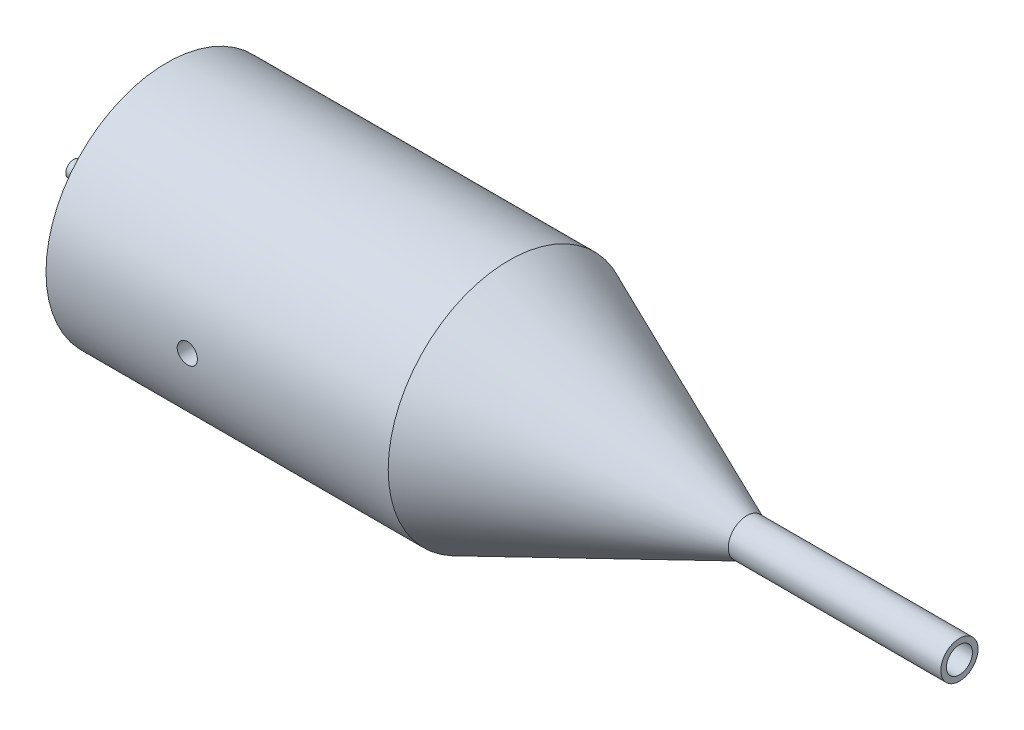
ISO-10303-21;
HEADER;
FILE_DESCRIPTION(('STEP AP214'),'2;1');
FILE_NAME('part.step','',(''),(''),'','','');
FILE_SCHEMA(('AUTOMOTIVE_DESIGN { 1 0 10303 214 1 1 1 1 }'));
ENDSEC;
DATA;
#1=APPLICATION_CONTEXT('core data for automotive mechanical design processes');
#2=APPLICATION_PROTOCOL_DEFINITION('international standard','automotive_design',2000,#1);
#3=PRODUCT_CONTEXT('',#1,'mechanical');
#4=PRODUCT('Part','Part','',(#3));
#5=PRODUCT_RELATED_PRODUCT_CATEGORY('part','',(#4));
#6=PRODUCT_DEFINITION_FORMATION('','',#4);
#7=PRODUCT_DEFINITION_CONTEXT('part definition',#1,'design');
#8=PRODUCT_DEFINITION('design','',#6,#7);
#9=PRODUCT_DEFINITION_SHAPE('','',#8);
#10=(LENGTH_UNIT() NAMED_UNIT(*) SI_UNIT(.MILLI.,.METRE.));
#11=(NAMED_UNIT(*) PLANE_ANGLE_UNIT() SI_UNIT($,.RADIAN.));
#12=(NAMED_UNIT(*) SI_UNIT($,.STERADIAN.) SOLID_ANGLE_UNIT());
#13=UNCERTAINTY_MEASURE_WITH_UNIT(LENGTH_MEASURE(1.E-05),#10,'distance_accuracy_value','');
#14=(GEOMETRIC_REPRESENTATION_CONTEXT(3) GLOBAL_UNCERTAINTY_ASSIGNED_CONTEXT((#13)) GLOBAL_UNIT_ASSIGNED_CONTEXT((#10,
#11,#12)) REPRESENTATION_CONTEXT('',''));
#15=CARTESIAN_POINT('',(0.,0.,0.));
#16=DIRECTION('',(0.,0.,1.));
#17=DIRECTION('',(1.,0.,0.));
#18=AXIS2_PLACEMENT_3D('',#15,#16,#17);
#19=CARTESIAN_POINT('',(9.,0.,0.));
#20=DIRECTION('',(-1.,0.,0.));
#21=DIRECTION('',(0.,0.,1.));
#22=AXIS2_PLACEMENT_3D('',#19,#20,#21);
#23=CYLINDRICAL_SURFACE('',#22,32.5);
#24=CARTESIAN_POINT('',(9.,0.,0.));
#25=DIRECTION('',(-1.,0.,0.));
#26=DIRECTION('',(0.,0.,1.));
#27=AXIS2_PLACEMENT_3D('',#24,#25,#26);
#28=CIRCLE('',#27,32.5);
#29=CARTESIAN_POINT('',(9.,0.,32.5));
#30=VERTEX_POINT('',#29);
#31=EDGE_CURVE('E10',#30,#30,#28,.T.);
#32=ORIENTED_EDGE('',*,*,#31,.F.);
#33=EDGE_LOOP('',(#32));
#34=FACE_BOUND('',#33,.T.);
#35=CARTESIAN_POINT('',(101.,0.,0.));
#36=DIRECTION('',(-1.,0.,0.));
#37=DIRECTION('',(0.,0.,1.));
#38=AXIS2_PLACEMENT_3D('',#35,#36,#37);
#39=CIRCLE('',#38,32.5);
#40=CARTESIAN_POINT('',(101.,0.,32.5));
#41=VERTEX_POINT('',#40);
#42=EDGE_CURVE('E51',#41,#41,#39,.T.);
#43=ORIENTED_EDGE('',*,*,#42,.T.);
#44=EDGE_LOOP('',(#43));
#45=FACE_BOUND('',#44,.T.);
#46=CARTESIAN_POINT('',(49.6902811109023,0.,32.5));
#47=CARTESIAN_POINT('',(49.6902744746451,-0.151941167269403,32.4999985197593));
#48=CARTESIAN_POINT('',(49.6774600385236,-0.303985760889427,32.4989231281155));
#49=CARTESIAN_POINT('',(49.6265294135974,-0.603868158196544,32.4947365734957));
#50=CARTESIAN_POINT('',(49.5883845620223,-0.751700998191363,32.4916231043788));
#51=CARTESIAN_POINT('',(49.4879038523232,-1.03877326034377,32.4837122309011));
#52=CARTESIAN_POINT('',(49.4255816845337,-1.17801749415064,32.4789157796706));
#53=CARTESIAN_POINT('',(49.2785399350075,-1.44403533126579,32.4681768340122));
#54=CARTESIAN_POINT('',(49.1938251432312,-1.57081159362435,32.4622345847529));
#55=CARTESIAN_POINT('',(49.0041694336048,-1.80865157464377,32.449853880183));
#56=CARTESIAN_POINT('',(48.8991831883501,-1.91967909517716,32.4434143326372));
#57=CARTESIAN_POINT('',(48.6720605050527,-2.1225593526944,32.430773973336));
#58=CARTESIAN_POINT('',(48.5499233138644,-2.21441124718268,32.4245731720799));
#59=CARTESIAN_POINT('',(48.2917466281172,-2.37645540989801,32.4131006250636));
#60=CARTESIAN_POINT('',(48.1556871020238,-2.44661586815149,32.4078302485589));
#61=CARTESIAN_POINT('',(47.8736675776469,-2.56308235778831,32.3988277713745));
#62=CARTESIAN_POINT('',(47.7277077544903,-2.60938881100221,32.3950956434931));
#63=CARTESIAN_POINT('',(47.4303935405317,-2.67672784085449,32.3896013974929));
#64=CARTESIAN_POINT('',(47.2790525913384,-2.69781938355965,32.3878346838505));
#65=CARTESIAN_POINT('',(46.9749690873465,-2.71431204383086,32.3864567708228));
#66=CARTESIAN_POINT('',(46.8222265589363,-2.70971364409196,32.3868455309377));
#67=CARTESIAN_POINT('',(46.5200797974212,-2.67500568607392,32.3897304651335));
#68=CARTESIAN_POINT('',(46.3706681450728,-2.64496021375881,32.3922213451746));
#69=CARTESIAN_POINT('',(46.0790159348937,-2.56031055532506,32.3990215527215));
#70=CARTESIAN_POINT('',(45.9367754471938,-2.50570612908276,32.4033308980073));
#71=CARTESIAN_POINT('',(45.6632990319933,-2.37341683190669,32.4132885686328));
#72=CARTESIAN_POINT('',(45.532077075681,-2.29570320939502,32.4189385601736));
#73=CARTESIAN_POINT('',(45.2845154211404,-2.1194222522946,32.4309393670627));
#74=CARTESIAN_POINT('',(45.168176024775,-2.02085449482894,32.4372901966212));
#75=CARTESIAN_POINT('',(44.9533093122456,-1.80530380842325,32.4500006435489));
#76=CARTESIAN_POINT('',(44.8548375650722,-1.68826547636449,32.4563602283834));
#77=CARTESIAN_POINT('',(44.678931055032,-1.43928921496152,32.4683531068598));
#78=CARTESIAN_POINT('',(44.6014963062444,-1.30735127564566,32.4739864000157));
#79=CARTESIAN_POINT('',(44.4698653376591,-1.03228490929455,32.4838930490368));
#80=CARTESIAN_POINT('',(44.4156715800493,-0.889155298493901,32.4881662608006));
#81=CARTESIAN_POINT('',(44.332099867983,-0.59578509824663,32.4948696179704));
#82=CARTESIAN_POINT('',(44.302721397858,-0.445544656633536,32.497299801675));
#83=CARTESIAN_POINT('',(44.2696838810737,-0.142699232933935,32.5000383696841));
#84=CARTESIAN_POINT('',(44.265948079465,0.00989732112447651,32.5003530860551));
#85=CARTESIAN_POINT('',(44.2841008728061,0.313546534508774,32.4988421710582));
#86=CARTESIAN_POINT('',(44.3059892284318,0.464599208240874,32.4970165596805));
#87=CARTESIAN_POINT('',(44.3747053891225,0.760653965310135,32.4914343732886));
#88=CARTESIAN_POINT('',(44.4214976161628,0.905664362852353,32.4876805532069));
#89=CARTESIAN_POINT('',(44.5386569201362,1.18577579793229,32.4786636417645));
#90=CARTESIAN_POINT('',(44.6090243702504,1.32087667856729,32.4734005265128));
#91=CARTESIAN_POINT('',(44.7715295239598,1.57768334962315,32.4619392352035));
#92=CARTESIAN_POINT('',(44.8637180749804,1.69935686579373,32.4557388875944));
#93=CARTESIAN_POINT('',(45.067175085578,1.9255291513138,32.4431070295538));
#94=CARTESIAN_POINT('',(45.1784438770711,2.03002762182758,32.4366755151025));
#95=CARTESIAN_POINT('',(45.4172359270607,2.2191467764188,32.4242874527941));
#96=CARTESIAN_POINT('',(45.5447989265551,2.30371737244325,32.4183321260995));
#97=CARTESIAN_POINT('',(45.8123605324419,2.45023668768206,32.4075880048209));
#98=CARTESIAN_POINT('',(45.9523590145219,2.51218563300379,32.4027991985774));
#99=CARTESIAN_POINT('',(46.240640202896,2.61161782887894,32.394937166541));
#100=CARTESIAN_POINT('',(46.3889122733649,2.64913173873047,32.3918617915635));
#101=CARTESIAN_POINT('',(46.6896773772303,2.69872880068884,32.3877676276574));
#102=CARTESIAN_POINT('',(46.8421703293973,2.7108124418478,32.386748799179));
#103=CARTESIAN_POINT('',(47.1465506989829,2.70920030132863,32.3868836593397));
#104=CARTESIAN_POINT('',(47.2984385423711,2.69558321957807,32.3880307156805));
#105=CARTESIAN_POINT('',(47.5977620393455,2.64312027795534,32.3923540083944));
#106=CARTESIAN_POINT('',(47.7451976861455,2.60427437962962,32.3955302478603));
#107=CARTESIAN_POINT('',(48.0314367561232,2.50247643356451,32.4035522775434));
#108=CARTESIAN_POINT('',(48.1702406870685,2.43952580536681,32.408397969444));
#109=CARTESIAN_POINT('',(48.4353228955034,2.2913141701718,32.4192130706327));
#110=CARTESIAN_POINT('',(48.5616013691844,2.20605351270178,32.4251824623158));
#111=CARTESIAN_POINT('',(48.79845080551,2.01534638315376,32.4375940959479));
#112=CARTESIAN_POINT('',(48.9089747852414,1.90984164724176,32.444037668795));
#113=CARTESIAN_POINT('',(49.1107901510252,1.6817468939352,32.4566594903095));
#114=CARTESIAN_POINT('',(49.2020768770564,1.55915274873429,32.4628376744015));
#115=CARTESIAN_POINT('',(49.3629489541397,1.30012264516969,32.4742437524398));
#116=CARTESIAN_POINT('',(49.4324935538627,1.16366132206948,32.4794698543391));
#117=CARTESIAN_POINT('',(49.5475937924504,0.881048131684025,32.4883619044997));
#118=CARTESIAN_POINT('',(49.5931770046591,0.73490762174897,32.4920296450943));
#119=CARTESIAN_POINT('',(49.6474521948513,0.489920951080691,32.4964502200154));
#120=CARTESIAN_POINT('',(49.6634916890606,0.392650292957181,32.4977753269755));
#121=CARTESIAN_POINT('',(49.6849082837345,0.19693423996146,32.4995506955535));
#122=CARTESIAN_POINT('',(49.6902854125498,0.0984888482135169,32.5000009594977));
#123=CARTESIAN_POINT('',(49.6902811109023,0.,32.5));
#124=B_SPLINE_CURVE_WITH_KNOTS('',3,(#46,#47,#48,#49,#50,#51,#52,#53,#54,#55,#56,#57,#58,#59,
#60,#61,#62,#63,#64,#65,#66,#67,#68,#69,#70,#71,#72,#73,#74,#75,#76,#77,#78,#79,#80,#81,#82,#83,
#84,#85,#86,#87,#88,#89,#90,#91,#92,#93,#94,#95,#96,#97,#98,#99,#100,#101,#102,#103,#104,#105,
#106,#107,#108,#109,#110,#111,#112,#113,#114,#115,#116,#117,#118,#119,#120,#121,#122,#123),
.UNSPECIFIED.,.T.,.F.,(4,2,2,2,2,2,2,2,2,2,2,2,2,2,2,2,2,2,2,2,2,2,2,2,2,2,2,2,2,2,2,2,2,2,2,2,
2,2,4),(0.,0.455463909606555,0.911444082111763,1.36716643316579,1.82279138036228,
2.27944716617639,2.73612301128607,3.19346541835276,3.65079973756905,4.10706245713107,
4.56331660388207,5.01842512414043,5.47353809429105,5.92921968472521,6.38491051628578,
6.84199513866114,7.29908006694453,7.75621340758106,8.21333724862765,8.66909220417615,
9.12484290310632,9.57994425094593,10.0350528030955,10.4912324722551,10.9474200778331,
11.4047423485132,11.8620600480518,12.318802827716,12.7755368236325,13.2308744921014,
13.6862128545938,14.1415244060659,14.5968288246795,15.0534638473905,15.5102093582722,
15.9678058861785,16.42487467998,16.7201089205909,17.0153423761852),.UNSPECIFIED.);
#125=CARTESIAN_POINT('',(49.6902811109023,0.,32.5));
#126=VERTEX_POINT('',#125);
#127=EDGE_CURVE('E127',#126,#126,#124,.T.);
#128=ORIENTED_EDGE('',*,*,#127,.T.);
#129=EDGE_LOOP('',(#128));
#130=FACE_BOUND('',#129,.T.);
#131=ADVANCED_FACE('F37',(#34,#45,#130),#23,.T.);
#132=CARTESIAN_POINT('',(27.0738651580763,0.,0.));
#133=DIRECTION('',(1.,0.,0.));
#134=DIRECTION('',(0.,0.,-1.));
#135=AXIS2_PLACEMENT_3D('',#132,#133,#134);
#136=CYLINDRICAL_SURFACE('',#135,3.50196924037433);
#137=CARTESIAN_POINT('',(27.0738651580763,0.,0.));
#138=DIRECTION('',(1.,0.,0.));
#139=DIRECTION('',(0.,0.,-1.));
#140=AXIS2_PLACEMENT_3D('',#137,#138,#139);
#141=CIRCLE('',#140,3.50196924037433);
#142=CARTESIAN_POINT('',(27.0738651580763,0.,-3.50196924037433));
#143=VERTEX_POINT('',#142);
#144=EDGE_CURVE('E119',#143,#143,#141,.T.);
#145=ORIENTED_EDGE('',*,*,#144,.F.);
#146=EDGE_LOOP('',(#145));
#147=FACE_BOUND('',#146,.T.);
#148=CARTESIAN_POINT('',(222.073865158076,0.,0.));
#149=DIRECTION('',(1.,0.,0.));
#150=DIRECTION('',(0.,0.,-1.));
#151=AXIS2_PLACEMENT_3D('',#148,#149,#150);
#152=CIRCLE('',#151,3.50196924037433);
#153=CARTESIAN_POINT('',(222.073865158076,0.,-3.50196924037433));
#154=VERTEX_POINT('',#153);
#155=EDGE_CURVE('E123',#154,#154,#152,.T.);
#156=ORIENTED_EDGE('',*,*,#155,.T.);
#157=EDGE_LOOP('',(#156));
#158=FACE_BOUND('',#157,.T.);
#159=CARTESIAN_POINT('',(44.2701947914688,0.,3.50196924037433));
#160=CARTESIAN_POINT('',(44.270204860189,0.131364044181929,3.50195951003828));
#161=CARTESIAN_POINT('',(44.2798169479154,0.262831944684322,3.49450671276186));
#162=CARTESIAN_POINT('',(44.317623814726,0.521508511711887,3.46537579077441));
#163=CARTESIAN_POINT('',(44.3458437363034,0.648711170423176,3.4436784192832));
#164=CARTESIAN_POINT('',(44.4188898432004,0.89453147061539,3.38812637813008));
#165=CARTESIAN_POINT('',(44.4636199173504,1.0131941407523,3.35434210469788));
#166=CARTESIAN_POINT('',(44.5675335199124,1.24049522230797,3.2771010638976));
#167=CARTESIAN_POINT('',(44.6267170693251,1.34913361916132,3.23364428247553));
#168=CARTESIAN_POINT('',(44.7636701784155,1.56492863426199,3.13530447269948));
#169=CARTESIAN_POINT('',(44.8426633458254,1.67098759551003,3.07973159331694));
#170=CARTESIAN_POINT('',(45.013604462946,1.86918354476369,2.9636401976897));
#171=CARTESIAN_POINT('',(45.1055707544134,1.96130043210795,2.90311473111682));
#172=CARTESIAN_POINT('',(45.3222969090855,2.14951618458273,2.76758526670217));
#173=CARTESIAN_POINT('',(45.4498512603296,2.24218696141918,2.69227465333503));
#174=CARTESIAN_POINT('',(45.7216139080248,2.40525910000834,2.54761079442379));
#175=CARTESIAN_POINT('',(45.8658032885228,2.47568542208572,2.47825093572307));
#176=CARTESIAN_POINT('',(46.1162401174985,2.57075651528601,2.37864373248274));
#177=CARTESIAN_POINT('',(46.2176274833999,2.60276754594091,2.34327764745161));
#178=CARTESIAN_POINT('',(46.4264923986581,2.65504023978956,2.28388255076528));
#179=CARTESIAN_POINT('',(46.5339549684402,2.67532952744826,2.25982690908634));
#180=CARTESIAN_POINT('',(46.7541907282568,2.70289586524251,2.22680287411813));
#181=CARTESIAN_POINT('',(46.867009329324,2.71002733863794,2.21800333635282));
#182=CARTESIAN_POINT('',(47.0926611245002,2.7100589209612,2.21796546206952));
#183=CARTESIAN_POINT('',(47.2054943184056,2.70295921062344,2.22672690252911));
#184=CARTESIAN_POINT('',(47.4125872017093,2.67710448428385,2.25770048092863));
#185=CARTESIAN_POINT('',(47.5073594538219,2.6599784835039,2.2780231355873));
#186=CARTESIAN_POINT('',(47.6923014861062,2.6165503160272,2.32777734613947));
#187=CARTESIAN_POINT('',(47.7824659356031,2.59023778531068,2.35721918582471));
#188=CARTESIAN_POINT('',(48.0153915524074,2.50928601495239,2.44390861618058));
#189=CARTESIAN_POINT('',(48.1535726308541,2.44741465093891,2.50668009143658));
#190=CARTESIAN_POINT('',(48.4154270375505,2.3036841458634,2.63940723611046));
#191=CARTESIAN_POINT('',(48.5390619082101,2.22177370888061,2.70938107150117));
#192=CARTESIAN_POINT('',(48.7754869403953,2.03587291681681,2.85187926858849));
#193=CARTESIAN_POINT('',(48.8877519082999,1.93121500370652,2.92440787700731));
#194=CARTESIAN_POINT('',(49.0945188464505,1.70230974244127,3.06330055390563));
#195=CARTESIAN_POINT('',(49.1890516384717,1.57809708861763,3.12967521554882));
#196=CARTESIAN_POINT('',(49.342455081712,1.33459771166877,3.23994219004701));
#197=CARTESIAN_POINT('',(49.4046741711938,1.21829406861975,3.2857353192445));
#198=CARTESIAN_POINT('',(49.5124940654451,0.97454355623625,3.36607777440004));
#199=CARTESIAN_POINT('',(49.5581038245232,0.847102737189874,3.40063315769674));
#200=CARTESIAN_POINT('',(49.6304093853546,0.582919040567584,3.45576477147167));
#201=CARTESIAN_POINT('',(49.6569643632714,0.446114927173427,3.47623687492789));
#202=CARTESIAN_POINT('',(49.6886250986803,0.168610799755473,3.50067265522229));
#203=CARTESIAN_POINT('',(49.6937456561549,0.0279135414512228,3.5046477228742));
#204=CARTESIAN_POINT('',(49.6828794464087,-0.235124362859808,3.49624423381858));
#205=CARTESIAN_POINT('',(49.6693536887421,-0.357640313450513,3.4857723171121));
#206=CARTESIAN_POINT('',(49.6262791159115,-0.598098426551059,3.45265096950695));
#207=CARTESIAN_POINT('',(49.5967278170983,-0.716039877065104,3.42999965104106));
#208=CARTESIAN_POINT('',(49.5227053217525,-0.946036707644035,3.37387117667682));
#209=CARTESIAN_POINT('',(49.4780541634696,-1.05800127684762,3.34026362585367));
#210=CARTESIAN_POINT('',(49.3758135632051,-1.27267505640429,3.26451510453526));
#211=CARTESIAN_POINT('',(49.3182218627631,-1.37538264678494,3.22237264460362));
#212=CARTESIAN_POINT('',(49.1817593846789,-1.58613258137139,3.12466408443881));
#213=CARTESIAN_POINT('',(49.1009607995412,-1.69242280988757,3.06802902664014));
#214=CARTESIAN_POINT('',(48.9261942787011,-1.89079589778004,2.949918958712));
#215=CARTESIAN_POINT('',(48.8322039935922,-1.98285407706686,2.88843581405799));
#216=CARTESIAN_POINT('',(48.6718643207921,-2.11872733285415,2.78905365419063));
#217=CARTESIAN_POINT('',(48.6092544388882,-2.16723882467798,2.75142796992028));
#218=CARTESIAN_POINT('',(48.4797472193093,-2.25878222215103,2.67678462118289));
#219=CARTESIAN_POINT('',(48.4128484679245,-2.3018123068969,2.63976716230463));
#220=CARTESIAN_POINT('',(48.2748852537854,-2.38213907044554,2.56751175680414));
#221=CARTESIAN_POINT('',(48.2038253973621,-2.41944192951512,2.53227191992288));
#222=CARTESIAN_POINT('',(48.0575075489746,-2.48804139447516,2.46490344927434));
#223=CARTESIAN_POINT('',(47.9822522347188,-2.51934177600312,2.43277286608891));
#224=CARTESIAN_POINT('',(47.8074345451126,-2.58279266729541,2.3655069710686));
#225=CARTESIAN_POINT('',(47.7066267593046,-2.61306169366681,2.33175056680893));
#226=CARTESIAN_POINT('',(47.4992850063033,-2.66199521661283,2.27573559575001));
#227=CARTESIAN_POINT('',(47.3927656000535,-2.68068782756289,2.25344919544609));
#228=CARTESIAN_POINT('',(47.1749536949438,-2.70527462626415,2.22388968058779));
#229=CARTESIAN_POINT('',(47.0636238434662,-2.71103759068965,2.21677053517352));
#230=CARTESIAN_POINT('',(46.8413060887775,-2.70876409968418,2.21954594091488));
#231=CARTESIAN_POINT('',(46.7303183129219,-2.70072301056695,2.22944620507545));
#232=CARTESIAN_POINT('',(46.5040425378127,-2.67051260453057,2.2655487981887));
#233=CARTESIAN_POINT('',(46.3891026799997,-2.64728203553513,2.29297182284574));
#234=CARTESIAN_POINT('',(46.1664377286311,-2.58755246923727,2.36016280504208));
#235=CARTESIAN_POINT('',(46.0587330595605,-2.55101763757673,2.39996406005537));
#236=CARTESIAN_POINT('',(45.8059275426586,-2.44771402092282,2.50600230738907));
#237=CARTESIAN_POINT('',(45.6650594648361,-2.37471021791902,2.57618993239483));
#238=CARTESIAN_POINT('',(45.39964203546,-2.20697357475071,2.72129325099906));
#239=CARTESIAN_POINT('',(45.2751163021123,-2.11220981859926,2.79621556068357));
#240=CARTESIAN_POINT('',(45.0401850047539,-1.89903107373898,2.94530977106293));
#241=CARTESIAN_POINT('',(44.930231406706,-1.78006461151971,3.01941136420935));
#242=CARTESIAN_POINT('',(44.7313006819048,-1.52090770842927,3.15786443745285));
#243=CARTESIAN_POINT('',(44.642280871524,-1.38076142894152,3.2222356601131));
#244=CARTESIAN_POINT('',(44.5088492519544,-1.11910063665726,3.32050394170417));
#245=CARTESIAN_POINT('',(44.4588492956605,-1.00178111480272,3.35799302322888));
#246=CARTESIAN_POINT('',(44.3753413489018,-0.758484623604669,3.42113812488249));
#247=CARTESIAN_POINT('',(44.3418010713756,-0.632525160223509,3.44681730486628));
#248=CARTESIAN_POINT('',(44.3018430949722,-0.421428415514226,3.47752228223521));
#249=CARTESIAN_POINT('',(44.2900111349162,-0.337869099047627,3.48665305639432));
#250=CARTESIAN_POINT('',(44.2741829853091,-0.169554430978335,3.49888025212818));
#251=CARTESIAN_POINT('',(44.2701882918521,-0.0847988541252624,3.5019755215554));
#252=CARTESIAN_POINT('',(44.2701947914688,0.,3.50196924037433));
#253=B_SPLINE_CURVE_WITH_KNOTS('',3,(#159,#160,#161,#162,#163,#164,#165,#166,#167,#168,#169,
#170,#171,#172,#173,#174,#175,#176,#177,#178,#179,#180,#181,#182,#183,#184,#185,#186,#187,#188,
#189,#190,#191,#192,#193,#194,#195,#196,#197,#198,#199,#200,#201,#202,#203,#204,#205,#206,#207,
#208,#209,#210,#211,#212,#213,#214,#215,#216,#217,#218,#219,#220,#221,#222,#223,#224,#225,#226,
#227,#228,#229,#230,#231,#232,#233,#234,#235,#236,#237,#238,#239,#240,#241,#242,#243,#244,#245,
#246,#247,#248,#249,#250,#251,#252),.UNSPECIFIED.,.T.,.F.,(4,2,2,2,2,2,2,2,2,2,2,2,2,2,2,2,2,2,
2,2,2,2,2,2,2,2,2,2,2,2,2,2,2,2,2,2,2,2,2,2,2,2,2,2,2,2,4),(0.,0.393734230144959,
0.78800155842583,1.18000901910792,1.57201704937344,2.00084592490451,2.43028728292249,
2.95237265750016,3.47387010576758,3.80896408296466,4.14326509323285,4.48124309477298,
4.81921680405824,5.11340816071109,5.40793249515406,5.89692395540879,6.38718047684639,
6.89444927064558,7.40082799774369,7.81805232337691,8.23505138372284,8.65510138200269,
9.07486129737211,9.44421060569774,9.81361717239225,10.1875913317453,10.5616308100629,
10.9951944286736,11.429501663277,11.692324405215,11.9552342294759,12.2178583221496,
12.4803166750341,12.8107859963495,13.1404495629013,13.4734440429685,13.8065503230713,
14.1658504326514,14.5261255448121,15.0438830801035,15.562380834225,16.0943761968854,
16.6252772381607,17.0224898181698,17.4189200860303,17.6730371083257,17.9272026355375),.UNSPECIFIED.);
#254=CARTESIAN_POINT('',(44.2701947914688,0.,3.50196924037433));
#255=VERTEX_POINT('',#254);
#256=EDGE_CURVE('E41',#255,#255,#253,.T.);
#257=ORIENTED_EDGE('',*,*,#256,.F.);
#258=EDGE_LOOP('',(#257));
#259=FACE_BOUND('',#258,.T.);
#260=ADVANCED_FACE('F148',(#147,#158,#259),#136,.F.);
#261=CARTESIAN_POINT('',(9.,0.,0.));
#262=DIRECTION('',(-1.,0.,0.));
#263=DIRECTION('',(0.,0.,1.));
#264=AXIS2_PLACEMENT_3D('',#261,#262,#263);
#265=PLANE('',#264);
#266=CARTESIAN_POINT('',(9.,0.,0.));
#267=DIRECTION('',(-1.,0.,0.));
#268=DIRECTION('',(0.,0.,1.));
#269=AXIS2_PLACEMENT_3D('',#266,#267,#268);
#270=CIRCLE('',#269,10.);
#271=CARTESIAN_POINT('',(9.,0.,10.));
#272=VERTEX_POINT('',#271);
#273=EDGE_CURVE('E115',#272,#272,#270,.T.);
#274=ORIENTED_EDGE('',*,*,#273,.F.);
#275=EDGE_LOOP('',(#274));
#276=FACE_BOUND('',#275,.T.);
#277=CARTESIAN_POINT('',(9.,6.39999999999968,-11.0851251684406));
#278=DIRECTION('',(-1.,0.,0.));
#279=DIRECTION('',(0.,0.,1.));
#280=AXIS2_PLACEMENT_3D('',#277,#278,#279);
#281=CIRCLE('',#280,2.1);
#282=CARTESIAN_POINT('',(9.,6.39999999999968,-8.98512516844064));
#283=VERTEX_POINT('',#282);
#284=EDGE_CURVE('E107',#283,#283,#281,.T.);
#285=ORIENTED_EDGE('',*,*,#284,.F.);
#286=EDGE_LOOP('',(#285));
#287=FACE_BOUND('',#286,.T.);
#288=CARTESIAN_POINT('',(9.,-6.40000000000032,-11.0851251684403));
#289=DIRECTION('',(-1.,0.,0.));
#290=DIRECTION('',(0.,0.,1.));
#291=AXIS2_PLACEMENT_3D('',#288,#289,#290);
#292=CIRCLE('',#291,2.1);
#293=CARTESIAN_POINT('',(9.,-6.40000000000032,-8.98512516844027));
#294=VERTEX_POINT('',#293);
#295=EDGE_CURVE('E99',#294,#294,#292,.T.);
#296=ORIENTED_EDGE('',*,*,#295,.F.);
#297=EDGE_LOOP('',(#296));
#298=FACE_BOUND('',#297,.T.);
#299=CARTESIAN_POINT('',(9.,-12.8,7.21636864371472E-13));
#300=DIRECTION('',(-1.,0.,0.));
#301=DIRECTION('',(0.,0.,1.));
#302=AXIS2_PLACEMENT_3D('',#299,#300,#301);
#303=CIRCLE('',#302,2.1);
#304=CARTESIAN_POINT('',(9.,-12.8,2.10000000000072));
#305=VERTEX_POINT('',#304);
#306=EDGE_CURVE('E91',#305,#305,#303,.T.);
#307=ORIENTED_EDGE('',*,*,#306,.F.);
#308=EDGE_LOOP('',(#307));
#309=FACE_BOUND('',#308,.T.);
#310=CARTESIAN_POINT('',(9.,-6.39999999999969,11.0851251684414));
#311=DIRECTION('',(-1.,0.,0.));
#312=DIRECTION('',(0.,0.,1.));
#313=AXIS2_PLACEMENT_3D('',#310,#311,#312);
#314=CIRCLE('',#313,2.1);
#315=CARTESIAN_POINT('',(9.,-6.39999999999969,13.1851251684414));
#316=VERTEX_POINT('',#315);
#317=EDGE_CURVE('E83',#316,#316,#314,.T.);
#318=ORIENTED_EDGE('',*,*,#317,.F.);
#319=EDGE_LOOP('',(#318));
#320=FACE_BOUND('',#319,.T.);
#321=CARTESIAN_POINT('',(9.,6.40000000000032,11.085125168441));
#322=DIRECTION('',(-1.,0.,0.));
#323=DIRECTION('',(0.,0.,1.));
#324=AXIS2_PLACEMENT_3D('',#321,#322,#323);
#325=CIRCLE('',#324,2.1);
#326=CARTESIAN_POINT('',(9.,6.40000000000032,13.185125168441));
#327=VERTEX_POINT('',#326);
#328=EDGE_CURVE('E75',#327,#327,#325,.T.);
#329=ORIENTED_EDGE('',*,*,#328,.F.);
#330=EDGE_LOOP('',(#329));
#331=FACE_BOUND('',#330,.T.);
#332=CARTESIAN_POINT('',(9.,12.8,0.));
#333=DIRECTION('',(-1.,0.,0.));
#334=DIRECTION('',(0.,0.,1.));
#335=AXIS2_PLACEMENT_3D('',#332,#333,#334);
#336=CIRCLE('',#335,2.1);
#337=CARTESIAN_POINT('',(9.,12.8,2.1));
#338=VERTEX_POINT('',#337);
#339=EDGE_CURVE('E67',#338,#338,#336,.T.);
#340=ORIENTED_EDGE('',*,*,#339,.F.);
#341=EDGE_LOOP('',(#340));
#342=FACE_BOUND('',#341,.T.);
#343=ORIENTED_EDGE('',*,*,#31,.T.);
#344=EDGE_LOOP('',(#343));
#345=FACE_BOUND('',#344,.T.);
#346=ADVANCED_FACE('F39',(#276,#287,#298,#309,#320,#331,#342,#345),#265,.T.);
#347=CARTESIAN_POINT('',(101.,0.,0.));
#348=DIRECTION('',(-1.,0.,0.));
#349=DIRECTION('',(0.,0.,1.));
#350=AXIS2_PLACEMENT_3D('',#347,#348,#349);
#351=CONICAL_SURFACE('',#350,32.5,0.40629389750073);
#352=CARTESIAN_POINT('',(164.919887290768,0.,0.));
#353=DIRECTION('',(-1.,0.,0.));
#354=DIRECTION('',(0.,0.,1.));
#355=AXIS2_PLACEMENT_3D('',#352,#353,#354);
#356=CIRCLE('',#355,4.99961461547425);
#357=CARTESIAN_POINT('',(164.919887290768,0.,4.99961461547425));
#358=VERTEX_POINT('',#357);
#359=EDGE_CURVE('E56',#358,#358,#356,.T.);
#360=CARTESIAN_POINT('',(164.919887290768,0.,4.99961461547425));
#361=CARTESIAN_POINT('',(164.25405513149,0.,5.28607696322973));
#362=CARTESIAN_POINT('',(163.588222972211,0.,5.5725393109852));
#363=CARTESIAN_POINT('',(162.256558653653,0.,6.14546400649615));
#364=CARTESIAN_POINT('',(161.590726494374,0.,6.43192635425163));
#365=CARTESIAN_POINT('',(160.259062175817,0.,7.00485104976258));
#366=CARTESIAN_POINT('',(159.593230016538,0.,7.29131339751806));
#367=CARTESIAN_POINT('',(158.26156569798,0.,7.86423809302901));
#368=CARTESIAN_POINT('',(157.595733538701,0.,8.15070044078449));
#369=CARTESIAN_POINT('',(156.264069220144,0.,8.72362513629544));
#370=CARTESIAN_POINT('',(155.598237060865,0.,9.01008748405092));
#371=CARTESIAN_POINT('',(154.266572742307,0.,9.58301217956187));
#372=CARTESIAN_POINT('',(153.600740583028,0.,9.86947452731735));
#373=CARTESIAN_POINT('',(152.269076264471,0.,10.4423992228283));
#374=CARTESIAN_POINT('',(151.603244105192,0.,10.7288615705838));
#375=CARTESIAN_POINT('',(150.271579786634,0.,11.3017862660947));
#376=CARTESIAN_POINT('',(149.605747627355,0.,11.5882486138502));
#377=CARTESIAN_POINT('',(148.274083308798,0.,12.1611733093612));
#378=CARTESIAN_POINT('',(147.608251149519,0.,12.4476356571166));
#379=CARTESIAN_POINT('',(146.276586830961,0.,13.0205603526276));
#380=CARTESIAN_POINT('',(145.610754671682,0.,13.3070227003831));
#381=CARTESIAN_POINT('',(144.279090353124,0.,13.879947395894));
#382=CARTESIAN_POINT('',(143.613258193846,0.,14.1664097436495));
#383=CARTESIAN_POINT('',(142.281593875288,0.,14.7393344391605));
#384=CARTESIAN_POINT('',(141.615761716009,0.,15.0257967869159));
#385=CARTESIAN_POINT('',(140.284097397451,0.,15.5987214824269));
#386=CARTESIAN_POINT('',(139.618265238173,0.,15.8851838301824));
#387=CARTESIAN_POINT('',(138.286600919615,0.,16.4581085256933));
#388=CARTESIAN_POINT('',(137.620768760336,0.,16.7445708734488));
#389=CARTESIAN_POINT('',(136.289104441778,0.,17.3174955689597));
#390=CARTESIAN_POINT('',(135.6232722825,0.,17.6039579167152));
#391=CARTESIAN_POINT('',(134.291607963942,0.,18.1768826122262));
#392=CARTESIAN_POINT('',(133.625775804663,0.,18.4633449599816));
#393=CARTESIAN_POINT('',(132.294111486105,0.,19.0362696554926));
#394=CARTESIAN_POINT('',(131.628279326827,0.,19.3227320032481));
#395=CARTESIAN_POINT('',(130.296615008269,0.,19.895656698759));
#396=CARTESIAN_POINT('',(129.63078284899,0.,20.1821190465145));
#397=CARTESIAN_POINT('',(128.299118530432,0.,20.7550437420255));
#398=CARTESIAN_POINT('',(127.633286371154,0.,21.0415060897809));
#399=CARTESIAN_POINT('',(126.301622052596,0.,21.6144307852919));
#400=CARTESIAN_POINT('',(125.635789893317,0.,21.9008931330474));
#401=CARTESIAN_POINT('',(124.304125574759,0.,22.4738178285583));
#402=CARTESIAN_POINT('',(123.638293415481,0.,22.7602801763138));
#403=CARTESIAN_POINT('',(122.306629096923,0.,23.3332048718248));
#404=CARTESIAN_POINT('',(121.640796937644,0.,23.6196672195802));
#405=CARTESIAN_POINT('',(120.309132619086,0.,24.1925919150912));
#406=CARTESIAN_POINT('',(119.643300459807,0.,24.4790542628467));
#407=CARTESIAN_POINT('',(118.31163614125,0.,25.0519789583576));
#408=CARTESIAN_POINT('',(117.645803981971,0.,25.3384413061131));
#409=CARTESIAN_POINT('',(116.314139663413,0.,25.911366001624));
#410=CARTESIAN_POINT('',(115.648307504134,0.,26.1978283493795));
#411=CARTESIAN_POINT('',(114.316643185577,0.,26.7707530448905));
#412=CARTESIAN_POINT('',(113.650811026298,0.,27.0572153926459));
#413=CARTESIAN_POINT('',(112.31914670774,0.,27.6301400881569));
#414=CARTESIAN_POINT('',(111.653314548461,0.,27.9166024359124));
#415=CARTESIAN_POINT('',(110.321650229904,0.,28.4895271314233));
#416=CARTESIAN_POINT('',(109.655818070625,0.,28.7759894791788));
#417=CARTESIAN_POINT('',(108.324153752067,0.,29.3489141746898));
#418=CARTESIAN_POINT('',(107.658321592788,0.,29.6353765224452));
#419=CARTESIAN_POINT('',(106.326657274231,0.,30.2083012179562));
#420=CARTESIAN_POINT('',(105.660825114952,0.,30.4947635657117));
#421=CARTESIAN_POINT('',(104.329160796394,0.,31.0676882612226));
#422=CARTESIAN_POINT('',(103.663328637115,0.,31.3541506089781));
#423=CARTESIAN_POINT('',(102.331664318558,0.,31.9270753044891));
#424=CARTESIAN_POINT('',(101.665832159279,0.,32.2135376522445));
#425=CARTESIAN_POINT('',(101.,0.,32.5));
#426=B_SPLINE_CURVE_WITH_KNOTS('',3,(#360,#361,#362,#363,#364,#365,#366,#367,#368,#369,#370,
#371,#372,#373,#374,#375,#376,#377,#378,#379,#380,#381,#382,#383,#384,#385,#386,#387,#388,#389,
#390,#391,#392,#393,#394,#395,#396,#397,#398,#399,#400,#401,#402,#403,#404,#405,#406,#407,#408,
#409,#410,#411,#412,#413,#414,#415,#416,#417,#418,#419,#420,#421,#422,#423,#424,#425),
.UNSPECIFIED.,.F.,.F.,(4,2,2,2,2,2,2,2,2,2,2,2,2,2,2,2,2,2,2,2,2,2,2,2,2,2,2,2,2,2,2,2,4),(0.,
2.1745202388351,4.34904047767023,6.52356071650533,8.69808095534044,10.8726011941755,
13.0471214330106,15.2216416718458,17.3961619106809,19.570682149516,21.7452023883511,
23.9197226271862,26.0942428660213,28.2687631048564,30.4432833436915,32.6178035825266,
34.7923238213617,36.9668440601968,39.141364299032,41.3158845378671,43.4904047767022,
45.6649250155373,47.8394452543724,50.0139654932075,52.1884857320426,54.3630059708777,
56.5375262097128,58.712046448548,60.8865666873831,63.0610869262182,65.2356071650533,
67.4101274038884,69.5846476427235),.UNSPECIFIED.);
#427=EDGE_CURVE('BSEAM214',#358,#41,#426,.T.);
#428=ORIENTED_EDGE('',*,*,#359,.T.);
#429=ORIENTED_EDGE('',*,*,#42,.F.);
#430=ORIENTED_EDGE('',*,*,#427,.T.);
#431=ORIENTED_EDGE('',*,*,#427,.F.);
#432=EDGE_LOOP('',(#428,#430,#429,#431));
#433=FACE_BOUND('',#432,.T.);
#434=ADVANCED_FACE('F214',(#433),#351,.T.);
#435=CARTESIAN_POINT('',(9.,0.,0.));
#436=DIRECTION('',(-1.,0.,0.));
#437=DIRECTION('',(0.,0.,1.));
#438=AXIS2_PLACEMENT_3D('',#435,#436,#437);
#439=CYLINDRICAL_SURFACE('',#438,4.99961461547425);
#440=CARTESIAN_POINT('',(222.073865158076,0.,0.));
#441=DIRECTION('',(-1.,0.,0.));
#442=DIRECTION('',(0.,0.,1.));
#443=AXIS2_PLACEMENT_3D('',#440,#441,#442);
#444=CIRCLE('',#443,4.99961461547425);
#445=CARTESIAN_POINT('',(222.073865158076,0.,4.99961461547425));
#446=VERTEX_POINT('',#445);
#447=EDGE_CURVE('E62',#446,#446,#444,.T.);
#448=ORIENTED_EDGE('',*,*,#447,.T.);
#449=EDGE_LOOP('',(#448));
#450=FACE_BOUND('',#449,.T.);
#451=ORIENTED_EDGE('',*,*,#359,.F.);
#452=EDGE_LOOP('',(#451));
#453=FACE_BOUND('',#452,.T.);
#454=ADVANCED_FACE('F211',(#450,#453),#439,.T.);
#455=CARTESIAN_POINT('',(222.073865158076,-4.99961461547425,0.));
#456=DIRECTION('',(1.,0.,0.));
#457=DIRECTION('',(0.,0.,-1.));
#458=AXIS2_PLACEMENT_3D('',#455,#456,#457);
#459=PLANE('',#458);
#460=ORIENTED_EDGE('',*,*,#155,.F.);
#461=EDGE_LOOP('',(#460));
#462=FACE_BOUND('',#461,.T.);
#463=ORIENTED_EDGE('',*,*,#447,.F.);
#464=EDGE_LOOP('',(#463));
#465=FACE_BOUND('',#464,.T.);
#466=ADVANCED_FACE('F207',(#462,#465),#459,.T.);
#467=CARTESIAN_POINT('',(-5.,12.8,0.));
#468=DIRECTION('',(1.,0.,0.));
#469=DIRECTION('',(0.,0.,-1.));
#470=AXIS2_PLACEMENT_3D('',#467,#468,#469);
#471=CYLINDRICAL_SURFACE('',#470,2.1);
#472=CARTESIAN_POINT('',(-5.,12.8,0.));
#473=DIRECTION('',(-1.,0.,0.));
#474=DIRECTION('',(0.,0.,1.));
#475=AXIS2_PLACEMENT_3D('',#472,#473,#474);
#476=CIRCLE('',#475,2.1);
#477=CARTESIAN_POINT('',(-5.,12.8,2.1));
#478=VERTEX_POINT('',#477);
#479=EDGE_CURVE('E66',#478,#478,#476,.T.);
#480=ORIENTED_EDGE('',*,*,#479,.F.);
#481=EDGE_LOOP('',(#480));
#482=FACE_BOUND('',#481,.T.);
#483=ORIENTED_EDGE('',*,*,#339,.T.);
#484=EDGE_LOOP('',(#483));
#485=FACE_BOUND('',#484,.T.);
#486=ADVANCED_FACE('F203',(#482,#485),#471,.T.);
#487=CARTESIAN_POINT('',(-5.,12.8,0.));
#488=DIRECTION('',(-1.,0.,0.));
#489=DIRECTION('',(0.,0.,1.));
#490=AXIS2_PLACEMENT_3D('',#487,#488,#489);
#491=PLANE('',#490);
#492=ORIENTED_EDGE('',*,*,#479,.T.);
#493=EDGE_LOOP('',(#492));
#494=FACE_BOUND('',#493,.T.);
#495=ADVANCED_FACE('F199',(#494),#491,.T.);
#496=CARTESIAN_POINT('',(-5.,6.40000000000032,11.085125168441));
#497=DIRECTION('',(1.,0.,0.));
#498=DIRECTION('',(0.,0.,-1.));
#499=AXIS2_PLACEMENT_3D('',#496,#497,#498);
#500=CYLINDRICAL_SURFACE('',#499,2.1);
#501=CARTESIAN_POINT('',(-5.,6.40000000000032,11.085125168441));
#502=DIRECTION('',(-1.,0.,0.));
#503=DIRECTION('',(0.,0.,1.));
#504=AXIS2_PLACEMENT_3D('',#501,#502,#503);
#505=CIRCLE('',#504,2.1);
#506=CARTESIAN_POINT('',(-5.,6.40000000000032,13.185125168441));
#507=VERTEX_POINT('',#506);
#508=EDGE_CURVE('E71',#507,#507,#505,.T.);
#509=ORIENTED_EDGE('',*,*,#508,.F.);
#510=EDGE_LOOP('',(#509));
#511=FACE_BOUND('',#510,.T.);
#512=ORIENTED_EDGE('',*,*,#328,.T.);
#513=EDGE_LOOP('',(#512));
#514=FACE_BOUND('',#513,.T.);
#515=ADVANCED_FACE('F195',(#511,#514),#500,.T.);
#516=CARTESIAN_POINT('',(-5.,6.40000000000032,11.085125168441));
#517=DIRECTION('',(-1.,0.,0.));
#518=DIRECTION('',(0.,0.,1.));
#519=AXIS2_PLACEMENT_3D('',#516,#517,#518);
#520=PLANE('',#519);
#521=ORIENTED_EDGE('',*,*,#508,.T.);
#522=EDGE_LOOP('',(#521));
#523=FACE_BOUND('',#522,.T.);
#524=ADVANCED_FACE('F191',(#523),#520,.T.);
#525=CARTESIAN_POINT('',(-5.,-6.39999999999969,11.0851251684414));
#526=DIRECTION('',(1.,0.,0.));
#527=DIRECTION('',(0.,0.,-1.));
#528=AXIS2_PLACEMENT_3D('',#525,#526,#527);
#529=CYLINDRICAL_SURFACE('',#528,2.1);
#530=CARTESIAN_POINT('',(-5.,-6.39999999999969,11.0851251684414));
#531=DIRECTION('',(-1.,0.,0.));
#532=DIRECTION('',(0.,0.,1.));
#533=AXIS2_PLACEMENT_3D('',#530,#531,#532);
#534=CIRCLE('',#533,2.1);
#535=CARTESIAN_POINT('',(-5.,-6.39999999999969,13.1851251684414));
#536=VERTEX_POINT('',#535);
#537=EDGE_CURVE('E79',#536,#536,#534,.T.);
#538=ORIENTED_EDGE('',*,*,#537,.F.);
#539=EDGE_LOOP('',(#538));
#540=FACE_BOUND('',#539,.T.);
#541=ORIENTED_EDGE('',*,*,#317,.T.);
#542=EDGE_LOOP('',(#541));
#543=FACE_BOUND('',#542,.T.);
#544=ADVANCED_FACE('F187',(#540,#543),#529,.T.);
#545=CARTESIAN_POINT('',(-5.,-6.39999999999969,11.0851251684414));
#546=DIRECTION('',(-1.,0.,0.));
#547=DIRECTION('',(0.,0.,1.));
#548=AXIS2_PLACEMENT_3D('',#545,#546,#547);
#549=PLANE('',#548);
#550=ORIENTED_EDGE('',*,*,#537,.T.);
#551=EDGE_LOOP('',(#550));
#552=FACE_BOUND('',#551,.T.);
#553=ADVANCED_FACE('F183',(#552),#549,.T.);
#554=CARTESIAN_POINT('',(-5.,-12.8,7.21636864371472E-13));
#555=DIRECTION('',(1.,0.,0.));
#556=DIRECTION('',(0.,0.,-1.));
#557=AXIS2_PLACEMENT_3D('',#554,#555,#556);
#558=CYLINDRICAL_SURFACE('',#557,2.1);
#559=CARTESIAN_POINT('',(-5.,-12.8,7.21636864371472E-13));
#560=DIRECTION('',(-1.,0.,0.));
#561=DIRECTION('',(0.,0.,1.));
#562=AXIS2_PLACEMENT_3D('',#559,#560,#561);
#563=CIRCLE('',#562,2.1);
#564=CARTESIAN_POINT('',(-5.,-12.8,2.10000000000072));
#565=VERTEX_POINT('',#564);
#566=EDGE_CURVE('E87',#565,#565,#563,.T.);
#567=ORIENTED_EDGE('',*,*,#566,.F.);
#568=EDGE_LOOP('',(#567));
#569=FACE_BOUND('',#568,.T.);
#570=ORIENTED_EDGE('',*,*,#306,.T.);
#571=EDGE_LOOP('',(#570));
#572=FACE_BOUND('',#571,.T.);
#573=ADVANCED_FACE('F179',(#569,#572),#558,.T.);
#574=CARTESIAN_POINT('',(-5.,-12.8,7.21636864371472E-13));
#575=DIRECTION('',(-1.,0.,0.));
#576=DIRECTION('',(0.,0.,1.));
#577=AXIS2_PLACEMENT_3D('',#574,#575,#576);
#578=PLANE('',#577);
#579=ORIENTED_EDGE('',*,*,#566,.T.);
#580=EDGE_LOOP('',(#579));
#581=FACE_BOUND('',#580,.T.);
#582=ADVANCED_FACE('F175',(#581),#578,.T.);
#583=CARTESIAN_POINT('',(-5.,-6.40000000000032,-11.0851251684403));
#584=DIRECTION('',(1.,0.,0.));
#585=DIRECTION('',(0.,0.,-1.));
#586=AXIS2_PLACEMENT_3D('',#583,#584,#585);
#587=CYLINDRICAL_SURFACE('',#586,2.1);
#588=CARTESIAN_POINT('',(-5.,-6.40000000000032,-11.0851251684403));
#589=DIRECTION('',(-1.,0.,0.));
#590=DIRECTION('',(0.,0.,1.));
#591=AXIS2_PLACEMENT_3D('',#588,#589,#590);
#592=CIRCLE('',#591,2.1);
#593=CARTESIAN_POINT('',(-5.,-6.40000000000032,-8.98512516844027));
#594=VERTEX_POINT('',#593);
#595=EDGE_CURVE('E95',#594,#594,#592,.T.);
#596=ORIENTED_EDGE('',*,*,#595,.F.);
#597=EDGE_LOOP('',(#596));
#598=FACE_BOUND('',#597,.T.);
#599=ORIENTED_EDGE('',*,*,#295,.T.);
#600=EDGE_LOOP('',(#599));
#601=FACE_BOUND('',#600,.T.);
#602=ADVANCED_FACE('F171',(#598,#601),#587,.T.);
#603=CARTESIAN_POINT('',(-5.,-6.40000000000032,-11.0851251684403));
#604=DIRECTION('',(-1.,0.,0.));
#605=DIRECTION('',(0.,0.,1.));
#606=AXIS2_PLACEMENT_3D('',#603,#604,#605);
#607=PLANE('',#606);
#608=ORIENTED_EDGE('',*,*,#595,.T.);
#609=EDGE_LOOP('',(#608));
#610=FACE_BOUND('',#609,.T.);
#611=ADVANCED_FACE('F167',(#610),#607,.T.);
#612=CARTESIAN_POINT('',(-5.,6.39999999999968,-11.0851251684406));
#613=DIRECTION('',(1.,0.,0.));
#614=DIRECTION('',(0.,0.,-1.));
#615=AXIS2_PLACEMENT_3D('',#612,#613,#614);
#616=CYLINDRICAL_SURFACE('',#615,2.1);
#617=CARTESIAN_POINT('',(-5.,6.39999999999968,-11.0851251684406));
#618=DIRECTION('',(-1.,0.,0.));
#619=DIRECTION('',(0.,0.,1.));
#620=AXIS2_PLACEMENT_3D('',#617,#618,#619);
#621=CIRCLE('',#620,2.1);
#622=CARTESIAN_POINT('',(-5.,6.39999999999968,-8.98512516844064));
#623=VERTEX_POINT('',#622);
#624=EDGE_CURVE('E103',#623,#623,#621,.T.);
#625=ORIENTED_EDGE('',*,*,#624,.F.);
#626=EDGE_LOOP('',(#625));
#627=FACE_BOUND('',#626,.T.);
#628=ORIENTED_EDGE('',*,*,#284,.T.);
#629=EDGE_LOOP('',(#628));
#630=FACE_BOUND('',#629,.T.);
#631=ADVANCED_FACE('F163',(#627,#630),#616,.T.);
#632=CARTESIAN_POINT('',(-5.,6.39999999999968,-11.0851251684406));
#633=DIRECTION('',(-1.,0.,0.));
#634=DIRECTION('',(0.,0.,1.));
#635=AXIS2_PLACEMENT_3D('',#632,#633,#634);
#636=PLANE('',#635);
#637=ORIENTED_EDGE('',*,*,#624,.T.);
#638=EDGE_LOOP('',(#637));
#639=FACE_BOUND('',#638,.T.);
#640=ADVANCED_FACE('F159',(#639),#636,.T.);
#641=CARTESIAN_POINT('',(4.,0.,0.));
#642=DIRECTION('',(1.,0.,0.));
#643=DIRECTION('',(0.,0.,-1.));
#644=AXIS2_PLACEMENT_3D('',#641,#642,#643);
#645=CYLINDRICAL_SURFACE('',#644,10.);
#646=CARTESIAN_POINT('',(4.,0.,0.));
#647=DIRECTION('',(-1.,0.,0.));
#648=DIRECTION('',(0.,0.,1.));
#649=AXIS2_PLACEMENT_3D('',#646,#647,#648);
#650=CIRCLE('',#649,10.);
#651=CARTESIAN_POINT('',(4.,0.,10.));
#652=VERTEX_POINT('',#651);
#653=EDGE_CURVE('E111',#652,#652,#650,.T.);
#654=ORIENTED_EDGE('',*,*,#653,.F.);
#655=EDGE_LOOP('',(#654));
#656=FACE_BOUND('',#655,.T.);
#657=ORIENTED_EDGE('',*,*,#273,.T.);
#658=EDGE_LOOP('',(#657));
#659=FACE_BOUND('',#658,.T.);
#660=ADVANCED_FACE('F155',(#656,#659),#645,.T.);
#661=CARTESIAN_POINT('',(4.,0.,0.));
#662=DIRECTION('',(-1.,0.,0.));
#663=DIRECTION('',(0.,0.,1.));
#664=AXIS2_PLACEMENT_3D('',#661,#662,#663);
#665=PLANE('',#664);
#666=ORIENTED_EDGE('',*,*,#653,.T.);
#667=EDGE_LOOP('',(#666));
#668=FACE_BOUND('',#667,.T.);
#669=ADVANCED_FACE('F146',(#668),#665,.T.);
#670=CARTESIAN_POINT('',(27.0738651580763,0.,0.));
#671=DIRECTION('',(1.,0.,0.));
#672=DIRECTION('',(0.,0.,-1.));
#673=AXIS2_PLACEMENT_3D('',#670,#671,#672);
#674=PLANE('',#673);
#675=ORIENTED_EDGE('',*,*,#144,.T.);
#676=EDGE_LOOP('',(#675));
#677=FACE_BOUND('',#676,.T.);
#678=ADVANCED_FACE('F142',(#677),#674,.T.);
#679=CARTESIAN_POINT('',(46.9802379511856,0.,45.));
#680=DIRECTION('',(0.,0.,-1.));
#681=DIRECTION('',(-1.,0.,0.));
#682=AXIS2_PLACEMENT_3D('',#679,#680,#681);
#683=CYLINDRICAL_SURFACE('',#682,2.71004315971676);
#684=ORIENTED_EDGE('',*,*,#127,.F.);
#685=EDGE_LOOP('',(#684));
#686=FACE_BOUND('',#685,.T.);
#687=ORIENTED_EDGE('',*,*,#256,.T.);
#688=EDGE_LOOP('',(#687));
#689=FACE_BOUND('',#688,.T.);
#690=ADVANCED_FACE('F138',(#686,#689),#683,.F.);
#691=CLOSED_SHELL('',(#131,#260,#346,#434,#454,#466,#486,#495,#515,#524,#544,#553,#573,#582,
#602,#611,#631,#640,#660,#669,#678,#690));
#692=MANIFOLD_SOLID_BREP('B2',#691);
#693=ADVANCED_BREP_SHAPE_REPRESENTATION('',(#18,#692),#14);
#694=SHAPE_DEFINITION_REPRESENTATION(#9,#693);
ENDSEC;
END-ISO-10303-21;
